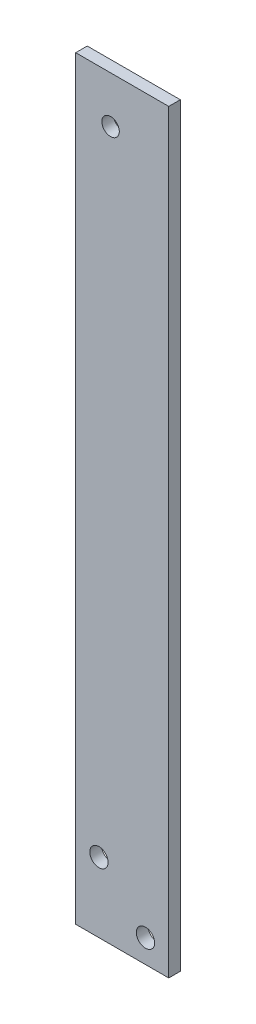
ISO-10303-21;
HEADER;
FILE_DESCRIPTION(('STEP AP214'),'2;1');
FILE_NAME('part.step','',(''),(''),'','','');
FILE_SCHEMA(('AUTOMOTIVE_DESIGN { 1 0 10303 214 1 1 1 1 }'));
ENDSEC;
DATA;
#1=APPLICATION_CONTEXT('core data for automotive mechanical design processes');
#2=APPLICATION_PROTOCOL_DEFINITION('international standard','automotive_design',2000,#1);
#3=PRODUCT_CONTEXT('',#1,'mechanical');
#4=PRODUCT('Part','Part','',(#3));
#5=PRODUCT_RELATED_PRODUCT_CATEGORY('part','',(#4));
#6=PRODUCT_DEFINITION_FORMATION('','',#4);
#7=PRODUCT_DEFINITION_CONTEXT('part definition',#1,'design');
#8=PRODUCT_DEFINITION('design','',#6,#7);
#9=PRODUCT_DEFINITION_SHAPE('','',#8);
#10=(LENGTH_UNIT() NAMED_UNIT(*) SI_UNIT(.MILLI.,.METRE.));
#11=(NAMED_UNIT(*) PLANE_ANGLE_UNIT() SI_UNIT($,.RADIAN.));
#12=(NAMED_UNIT(*) SI_UNIT($,.STERADIAN.) SOLID_ANGLE_UNIT());
#13=UNCERTAINTY_MEASURE_WITH_UNIT(LENGTH_MEASURE(1.E-05),#10,'distance_accuracy_value','');
#14=(GEOMETRIC_REPRESENTATION_CONTEXT(3) GLOBAL_UNCERTAINTY_ASSIGNED_CONTEXT((#13)) GLOBAL_UNIT_ASSIGNED_CONTEXT((#10,
#11,#12)) REPRESENTATION_CONTEXT('',''));
#15=CARTESIAN_POINT('',(0.,0.,0.));
#16=DIRECTION('',(0.,0.,1.));
#17=DIRECTION('',(1.,0.,0.));
#18=AXIS2_PLACEMENT_3D('',#15,#16,#17);
#19=CARTESIAN_POINT('',(0.,-412.09566061,6.31));
#20=DIRECTION('',(1.,0.,0.));
#21=DIRECTION('',(0.,0.,-1.));
#22=AXIS2_PLACEMENT_3D('',#19,#20,#21);
#23=PLANE('',#22);
#24=DIRECTION('',(0.,-1.,0.));
#25=VECTOR('',#24,1.);
#26=CARTESIAN_POINT('',(0.,-412.09566061,0.));
#27=LINE('',#26,#25);
#28=CARTESIAN_POINT('',(0.,0.,0.));
#29=VERTEX_POINT('',#28);
#30=CARTESIAN_POINT('',(0.,-412.09566061,0.));
#31=VERTEX_POINT('',#30);
#32=EDGE_CURVE('E98',#29,#31,#27,.T.);
#33=ORIENTED_EDGE('',*,*,#32,.T.);
#34=DIRECTION('',(0.,0.,-1.));
#35=VECTOR('',#34,1.);
#36=CARTESIAN_POINT('',(0.,-412.09566061,6.31));
#37=LINE('',#36,#35);
#38=CARTESIAN_POINT('',(0.,-412.09566061,6.31));
#39=VERTEX_POINT('',#38);
#40=EDGE_CURVE('E11',#39,#31,#37,.T.);
#41=ORIENTED_EDGE('',*,*,#40,.F.);
#42=DIRECTION('',(0.,-1.,0.));
#43=VECTOR('',#42,1.);
#44=CARTESIAN_POINT('',(0.,-412.09566061,6.31));
#45=LINE('',#44,#43);
#46=CARTESIAN_POINT('',(0.,0.,6.31));
#47=VERTEX_POINT('',#46);
#48=EDGE_CURVE('E84',#47,#39,#45,.T.);
#49=ORIENTED_EDGE('',*,*,#48,.F.);
#50=DIRECTION('',(0.,0.,-1.));
#51=VECTOR('',#50,1.);
#52=CARTESIAN_POINT('',(0.,0.,6.31));
#53=LINE('',#52,#51);
#54=EDGE_CURVE('E94',#47,#29,#53,.T.);
#55=ORIENTED_EDGE('',*,*,#54,.T.);
#56=EDGE_LOOP('',(#33,#41,#49,#55));
#57=FACE_BOUND('',#56,.T.);
#58=ADVANCED_FACE('F32',(#57),#23,.F.);
#59=CARTESIAN_POINT('',(50.8,-412.09566061,6.31));
#60=DIRECTION('',(0.,1.,0.));
#61=DIRECTION('',(0.,0.,1.));
#62=AXIS2_PLACEMENT_3D('',#59,#60,#61);
#63=PLANE('',#62);
#64=DIRECTION('',(1.,0.,0.));
#65=VECTOR('',#64,1.);
#66=CARTESIAN_POINT('',(50.8,-412.09566061,0.));
#67=LINE('',#66,#65);
#68=CARTESIAN_POINT('',(50.8,-412.09566061,0.));
#69=VERTEX_POINT('',#68);
#70=EDGE_CURVE('E89',#31,#69,#67,.T.);
#71=ORIENTED_EDGE('',*,*,#70,.T.);
#72=DIRECTION('',(0.,0.,-1.));
#73=VECTOR('',#72,1.);
#74=CARTESIAN_POINT('',(50.8,-412.09566061,6.31));
#75=LINE('',#74,#73);
#76=CARTESIAN_POINT('',(50.8,-412.09566061,6.31));
#77=VERTEX_POINT('',#76);
#78=EDGE_CURVE('E41',#77,#69,#75,.T.);
#79=ORIENTED_EDGE('',*,*,#78,.F.);
#80=DIRECTION('',(1.,0.,0.));
#81=VECTOR('',#80,1.);
#82=CARTESIAN_POINT('',(50.8,-412.09566061,6.31));
#83=LINE('',#82,#81);
#84=EDGE_CURVE('E79',#39,#77,#83,.T.);
#85=ORIENTED_EDGE('',*,*,#84,.F.);
#86=ORIENTED_EDGE('',*,*,#40,.T.);
#87=EDGE_LOOP('',(#71,#79,#85,#86));
#88=FACE_BOUND('',#87,.T.);
#89=ADVANCED_FACE('F88',(#88),#63,.F.);
#90=CARTESIAN_POINT('',(50.7999999999999,0.,6.31));
#91=DIRECTION('',(-1.,0.,0.));
#92=DIRECTION('',(0.,-1.,0.));
#93=AXIS2_PLACEMENT_3D('',#90,#91,#92);
#94=PLANE('',#93);
#95=DIRECTION('',(0.,1.,0.));
#96=VECTOR('',#95,1.);
#97=CARTESIAN_POINT('',(50.7999999999999,0.,0.));
#98=LINE('',#97,#96);
#99=CARTESIAN_POINT('',(50.7999999999999,0.,0.));
#100=VERTEX_POINT('',#99);
#101=EDGE_CURVE('E66',#69,#100,#98,.T.);
#102=ORIENTED_EDGE('',*,*,#101,.T.);
#103=DIRECTION('',(0.,0.,-1.));
#104=VECTOR('',#103,1.);
#105=CARTESIAN_POINT('',(50.7999999999999,0.,6.31));
#106=LINE('',#105,#104);
#107=CARTESIAN_POINT('',(50.7999999999999,0.,6.31));
#108=VERTEX_POINT('',#107);
#109=EDGE_CURVE('E90',#108,#100,#106,.T.);
#110=ORIENTED_EDGE('',*,*,#109,.F.);
#111=DIRECTION('',(0.,1.,0.));
#112=VECTOR('',#111,1.);
#113=CARTESIAN_POINT('',(50.8,-361.29566061,6.31));
#114=LINE('',#113,#112);
#115=EDGE_CURVE('E82',#77,#108,#114,.T.);
#116=ORIENTED_EDGE('',*,*,#115,.F.);
#117=ORIENTED_EDGE('',*,*,#78,.T.);
#118=EDGE_LOOP('',(#102,#110,#116,#117));
#119=FACE_BOUND('',#118,.T.);
#120=ADVANCED_FACE('F92',(#119),#94,.F.);
#121=CARTESIAN_POINT('',(0.,0.,6.31));
#122=DIRECTION('',(0.,-1.,0.));
#123=DIRECTION('',(0.,0.,-1.));
#124=AXIS2_PLACEMENT_3D('',#121,#122,#123);
#125=PLANE('',#124);
#126=DIRECTION('',(-1.,0.,0.));
#127=VECTOR('',#126,1.);
#128=CARTESIAN_POINT('',(0.,0.,0.));
#129=LINE('',#128,#127);
#130=EDGE_CURVE('E72',#100,#29,#129,.T.);
#131=ORIENTED_EDGE('',*,*,#130,.T.);
#132=ORIENTED_EDGE('',*,*,#54,.F.);
#133=DIRECTION('',(-1.,0.,0.));
#134=VECTOR('',#133,1.);
#135=CARTESIAN_POINT('',(0.,0.,6.31));
#136=LINE('',#135,#134);
#137=EDGE_CURVE('E50',#108,#47,#136,.T.);
#138=ORIENTED_EDGE('',*,*,#137,.F.);
#139=ORIENTED_EDGE('',*,*,#109,.T.);
#140=EDGE_LOOP('',(#131,#132,#138,#139));
#141=FACE_BOUND('',#140,.T.);
#142=ADVANCED_FACE('F131',(#141),#125,.F.);
#143=CARTESIAN_POINT('',(0.,0.,6.31));
#144=DIRECTION('',(0.,0.,-1.));
#145=DIRECTION('',(-1.,0.,0.));
#146=AXIS2_PLACEMENT_3D('',#143,#144,#145);
#147=PLANE('',#146);
#148=CARTESIAN_POINT('',(38.1000000000156,-399.395660605828,6.31));
#149=DIRECTION('',(0.,0.,1.));
#150=DIRECTION('',(1.,0.,0.));
#151=AXIS2_PLACEMENT_3D('',#148,#149,#150);
#152=CIRCLE('',#151,5.00000000000002);
#153=CARTESIAN_POINT('',(43.1000000000156,-399.395660605828,6.31));
#154=VERTEX_POINT('',#153);
#155=EDGE_CURVE('E121',#154,#154,#152,.T.);
#156=ORIENTED_EDGE('',*,*,#155,.F.);
#157=EDGE_LOOP('',(#156));
#158=FACE_BOUND('',#157,.T.);
#159=CARTESIAN_POINT('',(12.6999999999952,-373.995660605828,6.31));
#160=DIRECTION('',(0.,0.,1.));
#161=DIRECTION('',(1.,0.,0.));
#162=AXIS2_PLACEMENT_3D('',#159,#160,#161);
#163=CIRCLE('',#162,5.00000000000001);
#164=CARTESIAN_POINT('',(17.6999999999952,-373.995660605828,6.31));
#165=VERTEX_POINT('',#164);
#166=EDGE_CURVE('E111',#165,#165,#163,.T.);
#167=ORIENTED_EDGE('',*,*,#166,.F.);
#168=EDGE_LOOP('',(#167));
#169=FACE_BOUND('',#168,.T.);
#170=CARTESIAN_POINT('',(19.0400000000231,-25.4000000000005,6.31));
#171=DIRECTION('',(0.,0.,1.));
#172=DIRECTION('',(1.,0.,0.));
#173=AXIS2_PLACEMENT_3D('',#170,#171,#172);
#174=CIRCLE('',#173,4.7625);
#175=CARTESIAN_POINT('',(23.8025000000231,-25.4000000000005,6.31));
#176=VERTEX_POINT('',#175);
#177=EDGE_CURVE('E108',#176,#176,#174,.T.);
#178=ORIENTED_EDGE('',*,*,#177,.F.);
#179=EDGE_LOOP('',(#178));
#180=FACE_BOUND('',#179,.T.);
#181=ORIENTED_EDGE('',*,*,#48,.T.);
#182=ORIENTED_EDGE('',*,*,#84,.T.);
#183=ORIENTED_EDGE('',*,*,#115,.T.);
#184=ORIENTED_EDGE('',*,*,#137,.T.);
#185=EDGE_LOOP('',(#181,#182,#183,#184));
#186=FACE_BOUND('',#185,.T.);
#187=ADVANCED_FACE('F80',(#158,#169,#180,#186),#147,.F.);
#188=CARTESIAN_POINT('',(0.,0.,0.));
#189=DIRECTION('',(0.,0.,-1.));
#190=DIRECTION('',(-1.,0.,0.));
#191=AXIS2_PLACEMENT_3D('',#188,#189,#190);
#192=PLANE('',#191);
#193=CARTESIAN_POINT('',(38.1000000000156,-399.395660605828,0.));
#194=DIRECTION('',(0.,0.,-1.));
#195=DIRECTION('',(-1.,0.,0.));
#196=AXIS2_PLACEMENT_3D('',#193,#194,#195);
#197=CIRCLE('',#196,5.00000000000002);
#198=CARTESIAN_POINT('',(43.1000000000156,-399.395660605828,0.));
#199=VERTEX_POINT('',#198);
#200=EDGE_CURVE('E35',#199,#199,#197,.T.);
#201=ORIENTED_EDGE('',*,*,#200,.F.);
#202=EDGE_LOOP('',(#201));
#203=FACE_BOUND('',#202,.T.);
#204=CARTESIAN_POINT('',(12.6999999999952,-373.995660605828,0.));
#205=DIRECTION('',(0.,0.,-1.));
#206=DIRECTION('',(-1.,0.,0.));
#207=AXIS2_PLACEMENT_3D('',#204,#205,#206);
#208=CIRCLE('',#207,5.00000000000001);
#209=CARTESIAN_POINT('',(17.6999999999952,-373.995660605828,0.));
#210=VERTEX_POINT('',#209);
#211=EDGE_CURVE('E109',#210,#210,#208,.T.);
#212=ORIENTED_EDGE('',*,*,#211,.F.);
#213=EDGE_LOOP('',(#212));
#214=FACE_BOUND('',#213,.T.);
#215=CARTESIAN_POINT('',(19.0400000000231,-25.4000000000005,0.));
#216=DIRECTION('',(0.,0.,-1.));
#217=DIRECTION('',(-1.,0.,0.));
#218=AXIS2_PLACEMENT_3D('',#215,#216,#217);
#219=CIRCLE('',#218,4.7625);
#220=CARTESIAN_POINT('',(23.8025000000231,-25.4000000000005,0.));
#221=VERTEX_POINT('',#220);
#222=EDGE_CURVE('E101',#221,#221,#219,.T.);
#223=ORIENTED_EDGE('',*,*,#222,.F.);
#224=EDGE_LOOP('',(#223));
#225=FACE_BOUND('',#224,.T.);
#226=ORIENTED_EDGE('',*,*,#32,.F.);
#227=ORIENTED_EDGE('',*,*,#130,.F.);
#228=ORIENTED_EDGE('',*,*,#101,.F.);
#229=ORIENTED_EDGE('',*,*,#70,.F.);
#230=EDGE_LOOP('',(#226,#227,#228,#229));
#231=FACE_BOUND('',#230,.T.);
#232=ADVANCED_FACE('F130',(#203,#214,#225,#231),#192,.T.);
#233=CARTESIAN_POINT('',(19.0400000000231,-25.4000000000005,-3.215));
#234=DIRECTION('',(0.,0.,1.));
#235=DIRECTION('',(1.,0.,0.));
#236=AXIS2_PLACEMENT_3D('',#233,#234,#235);
#237=CYLINDRICAL_SURFACE('',#236,4.7625);
#238=CARTESIAN_POINT('',(23.8025000000231,-25.4000000000005,0.));
#239=CARTESIAN_POINT('',(23.8025000000231,-25.4000000000005,0.0657291666666671));
#240=CARTESIAN_POINT('',(23.8025000000231,-25.4000000000005,0.131458333333334));
#241=CARTESIAN_POINT('',(23.8025000000231,-25.4000000000005,0.262916666666667));
#242=CARTESIAN_POINT('',(23.8025000000231,-25.4000000000005,0.328645833333334));
#243=CARTESIAN_POINT('',(23.8025000000231,-25.4000000000005,0.460104166666667));
#244=CARTESIAN_POINT('',(23.8025000000231,-25.4000000000005,0.525833333333334));
#245=CARTESIAN_POINT('',(23.8025000000231,-25.4000000000005,0.657291666666667));
#246=CARTESIAN_POINT('',(23.8025000000231,-25.4000000000005,0.723020833333334));
#247=CARTESIAN_POINT('',(23.8025000000231,-25.4000000000005,0.854479166666667));
#248=CARTESIAN_POINT('',(23.8025000000231,-25.4000000000005,0.920208333333333));
#249=CARTESIAN_POINT('',(23.8025000000231,-25.4000000000005,1.05166666666667));
#250=CARTESIAN_POINT('',(23.8025000000231,-25.4000000000005,1.11739583333333));
#251=CARTESIAN_POINT('',(23.8025000000231,-25.4000000000005,1.24885416666667));
#252=CARTESIAN_POINT('',(23.8025000000231,-25.4000000000005,1.31458333333333));
#253=CARTESIAN_POINT('',(23.8025000000231,-25.4000000000005,1.44604166666667));
#254=CARTESIAN_POINT('',(23.8025000000231,-25.4000000000005,1.51177083333333));
#255=CARTESIAN_POINT('',(23.8025000000231,-25.4000000000005,1.64322916666667));
#256=CARTESIAN_POINT('',(23.8025000000231,-25.4000000000005,1.70895833333333));
#257=CARTESIAN_POINT('',(23.8025000000231,-25.4000000000005,1.84041666666667));
#258=CARTESIAN_POINT('',(23.8025000000231,-25.4000000000005,1.90614583333333));
#259=CARTESIAN_POINT('',(23.8025000000231,-25.4000000000005,2.03760416666667));
#260=CARTESIAN_POINT('',(23.8025000000231,-25.4000000000005,2.10333333333333));
#261=CARTESIAN_POINT('',(23.8025000000231,-25.4000000000005,2.23479166666667));
#262=CARTESIAN_POINT('',(23.8025000000231,-25.4000000000005,2.30052083333333));
#263=CARTESIAN_POINT('',(23.8025000000231,-25.4000000000005,2.43197916666667));
#264=CARTESIAN_POINT('',(23.8025000000231,-25.4000000000005,2.49770833333333));
#265=CARTESIAN_POINT('',(23.8025000000231,-25.4000000000005,2.62916666666667));
#266=CARTESIAN_POINT('',(23.8025000000231,-25.4000000000005,2.69489583333333));
#267=CARTESIAN_POINT('',(23.8025000000231,-25.4000000000005,2.82635416666667));
#268=CARTESIAN_POINT('',(23.8025000000231,-25.4000000000005,2.89208333333333));
#269=CARTESIAN_POINT('',(23.8025000000231,-25.4000000000005,3.02354166666667));
#270=CARTESIAN_POINT('',(23.8025000000231,-25.4000000000005,3.08927083333333));
#271=CARTESIAN_POINT('',(23.8025000000231,-25.4000000000005,3.22072916666667));
#272=CARTESIAN_POINT('',(23.8025000000231,-25.4000000000005,3.28645833333333));
#273=CARTESIAN_POINT('',(23.8025000000231,-25.4000000000005,3.41791666666667));
#274=CARTESIAN_POINT('',(23.8025000000231,-25.4000000000005,3.48364583333333));
#275=CARTESIAN_POINT('',(23.8025000000231,-25.4000000000005,3.61510416666667));
#276=CARTESIAN_POINT('',(23.8025000000231,-25.4000000000005,3.68083333333333));
#277=CARTESIAN_POINT('',(23.8025000000231,-25.4000000000005,3.81229166666667));
#278=CARTESIAN_POINT('',(23.8025000000231,-25.4000000000005,3.87802083333333));
#279=CARTESIAN_POINT('',(23.8025000000231,-25.4000000000005,4.00947916666667));
#280=CARTESIAN_POINT('',(23.8025000000231,-25.4000000000005,4.07520833333333));
#281=CARTESIAN_POINT('',(23.8025000000231,-25.4000000000005,4.20666666666667));
#282=CARTESIAN_POINT('',(23.8025000000231,-25.4000000000005,4.27239583333333));
#283=CARTESIAN_POINT('',(23.8025000000231,-25.4000000000005,4.40385416666667));
#284=CARTESIAN_POINT('',(23.8025000000231,-25.4000000000005,4.46958333333333));
#285=CARTESIAN_POINT('',(23.8025000000231,-25.4000000000005,4.60104166666667));
#286=CARTESIAN_POINT('',(23.8025000000231,-25.4000000000005,4.66677083333333));
#287=CARTESIAN_POINT('',(23.8025000000231,-25.4000000000005,4.79822916666667));
#288=CARTESIAN_POINT('',(23.8025000000231,-25.4000000000005,4.86395833333333));
#289=CARTESIAN_POINT('',(23.8025000000231,-25.4000000000005,4.99541666666667));
#290=CARTESIAN_POINT('',(23.8025000000231,-25.4000000000005,5.06114583333333));
#291=CARTESIAN_POINT('',(23.8025000000231,-25.4000000000005,5.19260416666667));
#292=CARTESIAN_POINT('',(23.8025000000231,-25.4000000000005,5.25833333333333));
#293=CARTESIAN_POINT('',(23.8025000000231,-25.4000000000005,5.38979166666667));
#294=CARTESIAN_POINT('',(23.8025000000231,-25.4000000000005,5.45552083333333));
#295=CARTESIAN_POINT('',(23.8025000000231,-25.4000000000005,5.58697916666667));
#296=CARTESIAN_POINT('',(23.8025000000231,-25.4000000000005,5.65270833333333));
#297=CARTESIAN_POINT('',(23.8025000000231,-25.4000000000005,5.78416666666667));
#298=CARTESIAN_POINT('',(23.8025000000231,-25.4000000000005,5.84989583333333));
#299=CARTESIAN_POINT('',(23.8025000000231,-25.4000000000005,5.98135416666667));
#300=CARTESIAN_POINT('',(23.8025000000231,-25.4000000000005,6.04708333333333));
#301=CARTESIAN_POINT('',(23.8025000000231,-25.4000000000005,6.17854166666667));
#302=CARTESIAN_POINT('',(23.8025000000231,-25.4000000000005,6.24427083333333));
#303=CARTESIAN_POINT('',(23.8025000000231,-25.4000000000005,6.31));
#304=B_SPLINE_CURVE_WITH_KNOTS('',3,(#238,#239,#240,#241,#242,#243,#244,#245,#246,#247,#248,
#249,#250,#251,#252,#253,#254,#255,#256,#257,#258,#259,#260,#261,#262,#263,#264,#265,#266,#267,
#268,#269,#270,#271,#272,#273,#274,#275,#276,#277,#278,#279,#280,#281,#282,#283,#284,#285,#286,
#287,#288,#289,#290,#291,#292,#293,#294,#295,#296,#297,#298,#299,#300,#301,#302,#303),
.UNSPECIFIED.,.F.,.F.,(4,2,2,2,2,2,2,2,2,2,2,2,2,2,2,2,2,2,2,2,2,2,2,2,2,2,2,2,2,2,2,2,4),(0.,
0.1971875,0.394375,0.5915625,0.78875,0.985937499999999,1.183125,1.3803125,1.5775,1.7746875,
1.971875,2.1690625,2.36625,2.5634375,2.760625,2.9578125,3.155,3.3521875,3.549375,3.7465625,
3.94375,4.1409375,4.338125,4.5353125,4.7325,4.9296875,5.126875,5.3240625,5.52125,5.7184375,
5.915625,6.1128125,6.31),.UNSPECIFIED.);
#305=EDGE_CURVE('BSEAM136',#221,#176,#304,.T.);
#306=ORIENTED_EDGE('',*,*,#222,.T.);
#307=ORIENTED_EDGE('',*,*,#177,.T.);
#308=ORIENTED_EDGE('',*,*,#305,.T.);
#309=ORIENTED_EDGE('',*,*,#305,.F.);
#310=EDGE_LOOP('',(#306,#308,#307,#309));
#311=FACE_BOUND('',#310,.T.);
#312=ADVANCED_FACE('F136',(#311),#237,.F.);
#313=CARTESIAN_POINT('',(12.6999999999952,-373.995660605828,-3.215));
#314=DIRECTION('',(0.,0.,1.));
#315=DIRECTION('',(1.,0.,0.));
#316=AXIS2_PLACEMENT_3D('',#313,#314,#315);
#317=CYLINDRICAL_SURFACE('',#316,5.00000000000001);
#318=CARTESIAN_POINT('',(17.6999999999952,-373.995660605828,0.));
#319=CARTESIAN_POINT('',(17.6999999999952,-373.995660605828,0.0657291666666671));
#320=CARTESIAN_POINT('',(17.6999999999952,-373.995660605828,0.131458333333334));
#321=CARTESIAN_POINT('',(17.6999999999952,-373.995660605828,0.262916666666667));
#322=CARTESIAN_POINT('',(17.6999999999952,-373.995660605828,0.328645833333334));
#323=CARTESIAN_POINT('',(17.6999999999952,-373.995660605828,0.460104166666667));
#324=CARTESIAN_POINT('',(17.6999999999952,-373.995660605828,0.525833333333334));
#325=CARTESIAN_POINT('',(17.6999999999952,-373.995660605828,0.657291666666667));
#326=CARTESIAN_POINT('',(17.6999999999952,-373.995660605828,0.723020833333334));
#327=CARTESIAN_POINT('',(17.6999999999952,-373.995660605828,0.854479166666667));
#328=CARTESIAN_POINT('',(17.6999999999952,-373.995660605828,0.920208333333333));
#329=CARTESIAN_POINT('',(17.6999999999952,-373.995660605828,1.05166666666667));
#330=CARTESIAN_POINT('',(17.6999999999952,-373.995660605828,1.11739583333333));
#331=CARTESIAN_POINT('',(17.6999999999952,-373.995660605828,1.24885416666667));
#332=CARTESIAN_POINT('',(17.6999999999952,-373.995660605828,1.31458333333333));
#333=CARTESIAN_POINT('',(17.6999999999952,-373.995660605828,1.44604166666667));
#334=CARTESIAN_POINT('',(17.6999999999952,-373.995660605828,1.51177083333333));
#335=CARTESIAN_POINT('',(17.6999999999952,-373.995660605828,1.64322916666667));
#336=CARTESIAN_POINT('',(17.6999999999952,-373.995660605828,1.70895833333333));
#337=CARTESIAN_POINT('',(17.6999999999952,-373.995660605828,1.84041666666667));
#338=CARTESIAN_POINT('',(17.6999999999952,-373.995660605828,1.90614583333333));
#339=CARTESIAN_POINT('',(17.6999999999952,-373.995660605828,2.03760416666667));
#340=CARTESIAN_POINT('',(17.6999999999952,-373.995660605828,2.10333333333333));
#341=CARTESIAN_POINT('',(17.6999999999952,-373.995660605828,2.23479166666667));
#342=CARTESIAN_POINT('',(17.6999999999952,-373.995660605828,2.30052083333333));
#343=CARTESIAN_POINT('',(17.6999999999952,-373.995660605828,2.43197916666667));
#344=CARTESIAN_POINT('',(17.6999999999952,-373.995660605828,2.49770833333333));
#345=CARTESIAN_POINT('',(17.6999999999952,-373.995660605828,2.62916666666667));
#346=CARTESIAN_POINT('',(17.6999999999952,-373.995660605828,2.69489583333333));
#347=CARTESIAN_POINT('',(17.6999999999952,-373.995660605828,2.82635416666667));
#348=CARTESIAN_POINT('',(17.6999999999952,-373.995660605828,2.89208333333333));
#349=CARTESIAN_POINT('',(17.6999999999952,-373.995660605828,3.02354166666667));
#350=CARTESIAN_POINT('',(17.6999999999952,-373.995660605828,3.08927083333333));
#351=CARTESIAN_POINT('',(17.6999999999952,-373.995660605828,3.22072916666667));
#352=CARTESIAN_POINT('',(17.6999999999952,-373.995660605828,3.28645833333333));
#353=CARTESIAN_POINT('',(17.6999999999952,-373.995660605828,3.41791666666667));
#354=CARTESIAN_POINT('',(17.6999999999952,-373.995660605828,3.48364583333333));
#355=CARTESIAN_POINT('',(17.6999999999952,-373.995660605828,3.61510416666667));
#356=CARTESIAN_POINT('',(17.6999999999952,-373.995660605828,3.68083333333333));
#357=CARTESIAN_POINT('',(17.6999999999952,-373.995660605828,3.81229166666667));
#358=CARTESIAN_POINT('',(17.6999999999952,-373.995660605828,3.87802083333333));
#359=CARTESIAN_POINT('',(17.6999999999952,-373.995660605828,4.00947916666667));
#360=CARTESIAN_POINT('',(17.6999999999952,-373.995660605828,4.07520833333333));
#361=CARTESIAN_POINT('',(17.6999999999952,-373.995660605828,4.20666666666667));
#362=CARTESIAN_POINT('',(17.6999999999952,-373.995660605828,4.27239583333333));
#363=CARTESIAN_POINT('',(17.6999999999952,-373.995660605828,4.40385416666667));
#364=CARTESIAN_POINT('',(17.6999999999952,-373.995660605828,4.46958333333333));
#365=CARTESIAN_POINT('',(17.6999999999952,-373.995660605828,4.60104166666667));
#366=CARTESIAN_POINT('',(17.6999999999952,-373.995660605828,4.66677083333333));
#367=CARTESIAN_POINT('',(17.6999999999952,-373.995660605828,4.79822916666667));
#368=CARTESIAN_POINT('',(17.6999999999952,-373.995660605828,4.86395833333333));
#369=CARTESIAN_POINT('',(17.6999999999952,-373.995660605828,4.99541666666667));
#370=CARTESIAN_POINT('',(17.6999999999952,-373.995660605828,5.06114583333333));
#371=CARTESIAN_POINT('',(17.6999999999952,-373.995660605828,5.19260416666667));
#372=CARTESIAN_POINT('',(17.6999999999952,-373.995660605828,5.25833333333333));
#373=CARTESIAN_POINT('',(17.6999999999952,-373.995660605828,5.38979166666667));
#374=CARTESIAN_POINT('',(17.6999999999952,-373.995660605828,5.45552083333333));
#375=CARTESIAN_POINT('',(17.6999999999952,-373.995660605828,5.58697916666667));
#376=CARTESIAN_POINT('',(17.6999999999952,-373.995660605828,5.65270833333333));
#377=CARTESIAN_POINT('',(17.6999999999952,-373.995660605828,5.78416666666667));
#378=CARTESIAN_POINT('',(17.6999999999952,-373.995660605828,5.84989583333333));
#379=CARTESIAN_POINT('',(17.6999999999952,-373.995660605828,5.98135416666667));
#380=CARTESIAN_POINT('',(17.6999999999952,-373.995660605828,6.04708333333333));
#381=CARTESIAN_POINT('',(17.6999999999952,-373.995660605828,6.17854166666667));
#382=CARTESIAN_POINT('',(17.6999999999952,-373.995660605828,6.24427083333333));
#383=CARTESIAN_POINT('',(17.6999999999952,-373.995660605828,6.31));
#384=B_SPLINE_CURVE_WITH_KNOTS('',3,(#318,#319,#320,#321,#322,#323,#324,#325,#326,#327,#328,
#329,#330,#331,#332,#333,#334,#335,#336,#337,#338,#339,#340,#341,#342,#343,#344,#345,#346,#347,
#348,#349,#350,#351,#352,#353,#354,#355,#356,#357,#358,#359,#360,#361,#362,#363,#364,#365,#366,
#367,#368,#369,#370,#371,#372,#373,#374,#375,#376,#377,#378,#379,#380,#381,#382,#383),
.UNSPECIFIED.,.F.,.F.,(4,2,2,2,2,2,2,2,2,2,2,2,2,2,2,2,2,2,2,2,2,2,2,2,2,2,2,2,2,2,2,2,4),(0.,
0.1971875,0.394375,0.5915625,0.78875,0.985937499999999,1.183125,1.3803125,1.5775,1.7746875,
1.971875,2.1690625,2.36625,2.5634375,2.760625,2.9578125,3.155,3.3521875,3.549375,3.7465625,
3.94375,4.1409375,4.338125,4.5353125,4.7325,4.9296875,5.126875,5.3240625,5.52125,5.7184375,
5.915625,6.1128125,6.31),.UNSPECIFIED.);
#385=EDGE_CURVE('BSEAM138',#210,#165,#384,.T.);
#386=ORIENTED_EDGE('',*,*,#211,.T.);
#387=ORIENTED_EDGE('',*,*,#166,.T.);
#388=ORIENTED_EDGE('',*,*,#385,.T.);
#389=ORIENTED_EDGE('',*,*,#385,.F.);
#390=EDGE_LOOP('',(#386,#388,#387,#389));
#391=FACE_BOUND('',#390,.T.);
#392=ADVANCED_FACE('F138',(#391),#317,.F.);
#393=CARTESIAN_POINT('',(38.1000000000156,-399.395660605828,-3.215));
#394=DIRECTION('',(0.,0.,1.));
#395=DIRECTION('',(1.,0.,0.));
#396=AXIS2_PLACEMENT_3D('',#393,#394,#395);
#397=CYLINDRICAL_SURFACE('',#396,5.00000000000002);
#398=CARTESIAN_POINT('',(43.1000000000156,-399.395660605828,0.));
#399=CARTESIAN_POINT('',(43.1000000000156,-399.395660605828,0.0657291666666671));
#400=CARTESIAN_POINT('',(43.1000000000156,-399.395660605828,0.131458333333334));
#401=CARTESIAN_POINT('',(43.1000000000156,-399.395660605828,0.262916666666667));
#402=CARTESIAN_POINT('',(43.1000000000156,-399.395660605828,0.328645833333334));
#403=CARTESIAN_POINT('',(43.1000000000156,-399.395660605828,0.460104166666667));
#404=CARTESIAN_POINT('',(43.1000000000156,-399.395660605828,0.525833333333334));
#405=CARTESIAN_POINT('',(43.1000000000156,-399.395660605828,0.657291666666667));
#406=CARTESIAN_POINT('',(43.1000000000156,-399.395660605828,0.723020833333334));
#407=CARTESIAN_POINT('',(43.1000000000156,-399.395660605828,0.854479166666667));
#408=CARTESIAN_POINT('',(43.1000000000156,-399.395660605828,0.920208333333333));
#409=CARTESIAN_POINT('',(43.1000000000156,-399.395660605828,1.05166666666667));
#410=CARTESIAN_POINT('',(43.1000000000156,-399.395660605828,1.11739583333333));
#411=CARTESIAN_POINT('',(43.1000000000156,-399.395660605828,1.24885416666667));
#412=CARTESIAN_POINT('',(43.1000000000156,-399.395660605828,1.31458333333333));
#413=CARTESIAN_POINT('',(43.1000000000156,-399.395660605828,1.44604166666667));
#414=CARTESIAN_POINT('',(43.1000000000156,-399.395660605828,1.51177083333333));
#415=CARTESIAN_POINT('',(43.1000000000156,-399.395660605828,1.64322916666667));
#416=CARTESIAN_POINT('',(43.1000000000156,-399.395660605828,1.70895833333333));
#417=CARTESIAN_POINT('',(43.1000000000156,-399.395660605828,1.84041666666667));
#418=CARTESIAN_POINT('',(43.1000000000156,-399.395660605828,1.90614583333333));
#419=CARTESIAN_POINT('',(43.1000000000156,-399.395660605828,2.03760416666667));
#420=CARTESIAN_POINT('',(43.1000000000156,-399.395660605828,2.10333333333333));
#421=CARTESIAN_POINT('',(43.1000000000156,-399.395660605828,2.23479166666667));
#422=CARTESIAN_POINT('',(43.1000000000156,-399.395660605828,2.30052083333333));
#423=CARTESIAN_POINT('',(43.1000000000156,-399.395660605828,2.43197916666667));
#424=CARTESIAN_POINT('',(43.1000000000156,-399.395660605828,2.49770833333333));
#425=CARTESIAN_POINT('',(43.1000000000156,-399.395660605828,2.62916666666667));
#426=CARTESIAN_POINT('',(43.1000000000156,-399.395660605828,2.69489583333333));
#427=CARTESIAN_POINT('',(43.1000000000156,-399.395660605828,2.82635416666667));
#428=CARTESIAN_POINT('',(43.1000000000156,-399.395660605828,2.89208333333333));
#429=CARTESIAN_POINT('',(43.1000000000156,-399.395660605828,3.02354166666667));
#430=CARTESIAN_POINT('',(43.1000000000156,-399.395660605828,3.08927083333333));
#431=CARTESIAN_POINT('',(43.1000000000156,-399.395660605828,3.22072916666667));
#432=CARTESIAN_POINT('',(43.1000000000156,-399.395660605828,3.28645833333333));
#433=CARTESIAN_POINT('',(43.1000000000156,-399.395660605828,3.41791666666667));
#434=CARTESIAN_POINT('',(43.1000000000156,-399.395660605828,3.48364583333333));
#435=CARTESIAN_POINT('',(43.1000000000156,-399.395660605828,3.61510416666667));
#436=CARTESIAN_POINT('',(43.1000000000156,-399.395660605828,3.68083333333333));
#437=CARTESIAN_POINT('',(43.1000000000156,-399.395660605828,3.81229166666667));
#438=CARTESIAN_POINT('',(43.1000000000156,-399.395660605828,3.87802083333333));
#439=CARTESIAN_POINT('',(43.1000000000156,-399.395660605828,4.00947916666667));
#440=CARTESIAN_POINT('',(43.1000000000156,-399.395660605828,4.07520833333333));
#441=CARTESIAN_POINT('',(43.1000000000156,-399.395660605828,4.20666666666667));
#442=CARTESIAN_POINT('',(43.1000000000156,-399.395660605828,4.27239583333333));
#443=CARTESIAN_POINT('',(43.1000000000156,-399.395660605828,4.40385416666667));
#444=CARTESIAN_POINT('',(43.1000000000156,-399.395660605828,4.46958333333333));
#445=CARTESIAN_POINT('',(43.1000000000156,-399.395660605828,4.60104166666667));
#446=CARTESIAN_POINT('',(43.1000000000156,-399.395660605828,4.66677083333333));
#447=CARTESIAN_POINT('',(43.1000000000156,-399.395660605828,4.79822916666667));
#448=CARTESIAN_POINT('',(43.1000000000156,-399.395660605828,4.86395833333333));
#449=CARTESIAN_POINT('',(43.1000000000156,-399.395660605828,4.99541666666667));
#450=CARTESIAN_POINT('',(43.1000000000156,-399.395660605828,5.06114583333333));
#451=CARTESIAN_POINT('',(43.1000000000156,-399.395660605828,5.19260416666667));
#452=CARTESIAN_POINT('',(43.1000000000156,-399.395660605828,5.25833333333333));
#453=CARTESIAN_POINT('',(43.1000000000156,-399.395660605828,5.38979166666667));
#454=CARTESIAN_POINT('',(43.1000000000156,-399.395660605828,5.45552083333333));
#455=CARTESIAN_POINT('',(43.1000000000156,-399.395660605828,5.58697916666667));
#456=CARTESIAN_POINT('',(43.1000000000156,-399.395660605828,5.65270833333333));
#457=CARTESIAN_POINT('',(43.1000000000156,-399.395660605828,5.78416666666667));
#458=CARTESIAN_POINT('',(43.1000000000156,-399.395660605828,5.84989583333333));
#459=CARTESIAN_POINT('',(43.1000000000156,-399.395660605828,5.98135416666667));
#460=CARTESIAN_POINT('',(43.1000000000156,-399.395660605828,6.04708333333333));
#461=CARTESIAN_POINT('',(43.1000000000156,-399.395660605828,6.17854166666667));
#462=CARTESIAN_POINT('',(43.1000000000156,-399.395660605828,6.24427083333333));
#463=CARTESIAN_POINT('',(43.1000000000156,-399.395660605828,6.31));
#464=B_SPLINE_CURVE_WITH_KNOTS('',3,(#398,#399,#400,#401,#402,#403,#404,#405,#406,#407,#408,
#409,#410,#411,#412,#413,#414,#415,#416,#417,#418,#419,#420,#421,#422,#423,#424,#425,#426,#427,
#428,#429,#430,#431,#432,#433,#434,#435,#436,#437,#438,#439,#440,#441,#442,#443,#444,#445,#446,
#447,#448,#449,#450,#451,#452,#453,#454,#455,#456,#457,#458,#459,#460,#461,#462,#463),
.UNSPECIFIED.,.F.,.F.,(4,2,2,2,2,2,2,2,2,2,2,2,2,2,2,2,2,2,2,2,2,2,2,2,2,2,2,2,2,2,2,2,4),(0.,
0.1971875,0.394375,0.5915625,0.78875,0.985937499999999,1.183125,1.3803125,1.5775,1.7746875,
1.971875,2.1690625,2.36625,2.5634375,2.760625,2.9578125,3.155,3.3521875,3.549375,3.7465625,
3.94375,4.1409375,4.338125,4.5353125,4.7325,4.9296875,5.126875,5.3240625,5.52125,5.7184375,
5.915625,6.1128125,6.31),.UNSPECIFIED.);
#465=EDGE_CURVE('BSEAM126',#199,#154,#464,.T.);
#466=ORIENTED_EDGE('',*,*,#200,.T.);
#467=ORIENTED_EDGE('',*,*,#155,.T.);
#468=ORIENTED_EDGE('',*,*,#465,.T.);
#469=ORIENTED_EDGE('',*,*,#465,.F.);
#470=EDGE_LOOP('',(#466,#468,#467,#469));
#471=FACE_BOUND('',#470,.T.);
#472=ADVANCED_FACE('F126',(#471),#397,.F.);
#473=CLOSED_SHELL('',(#58,#89,#120,#142,#187,#232,#312,#392,#472));
#474=MANIFOLD_SOLID_BREP('B2',#473);
#475=ADVANCED_BREP_SHAPE_REPRESENTATION('',(#18,#474),#14);
#476=SHAPE_DEFINITION_REPRESENTATION(#9,#475);
ENDSEC;
END-ISO-10303-21;
